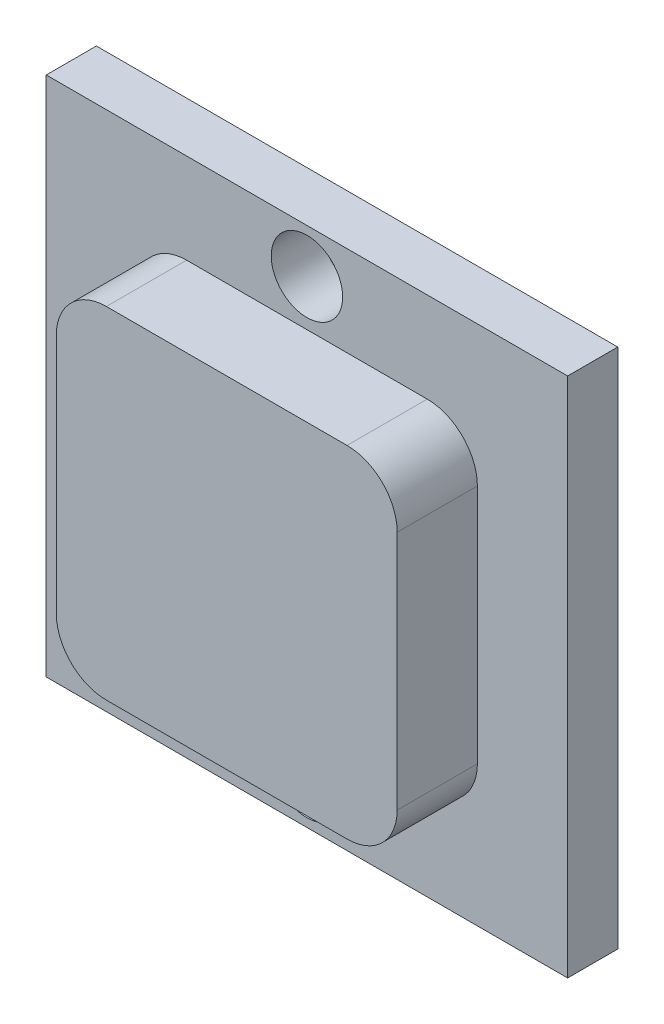
ISO-10303-21;
HEADER;
FILE_DESCRIPTION(('STEP AP214'),'2;1');
FILE_NAME('part.step','',(''),(''),'','','');
FILE_SCHEMA(('AUTOMOTIVE_DESIGN { 1 0 10303 214 1 1 1 1 }'));
ENDSEC;
DATA;
#1=APPLICATION_CONTEXT('core data for automotive mechanical design processes');
#2=APPLICATION_PROTOCOL_DEFINITION('international standard','automotive_design',2000,#1);
#3=PRODUCT_CONTEXT('',#1,'mechanical');
#4=PRODUCT('Part','Part','',(#3));
#5=PRODUCT_RELATED_PRODUCT_CATEGORY('part','',(#4));
#6=PRODUCT_DEFINITION_FORMATION('','',#4);
#7=PRODUCT_DEFINITION_CONTEXT('part definition',#1,'design');
#8=PRODUCT_DEFINITION('design','',#6,#7);
#9=PRODUCT_DEFINITION_SHAPE('','',#8);
#10=(LENGTH_UNIT() NAMED_UNIT(*) SI_UNIT(.MILLI.,.METRE.));
#11=(NAMED_UNIT(*) PLANE_ANGLE_UNIT() SI_UNIT($,.RADIAN.));
#12=(NAMED_UNIT(*) SI_UNIT($,.STERADIAN.) SOLID_ANGLE_UNIT());
#13=UNCERTAINTY_MEASURE_WITH_UNIT(LENGTH_MEASURE(1.E-05),#10,'distance_accuracy_value','');
#14=(GEOMETRIC_REPRESENTATION_CONTEXT(3) GLOBAL_UNCERTAINTY_ASSIGNED_CONTEXT((#13)) GLOBAL_UNIT_ASSIGNED_CONTEXT((#10,
#11,#12)) REPRESENTATION_CONTEXT('',''));
#15=CARTESIAN_POINT('',(0.,0.,0.));
#16=DIRECTION('',(0.,0.,1.));
#17=DIRECTION('',(1.,0.,0.));
#18=AXIS2_PLACEMENT_3D('',#15,#16,#17);
#19=CARTESIAN_POINT('',(0.,0.,4.1275));
#20=DIRECTION('',(0.,0.,1.));
#21=DIRECTION('',(1.,0.,0.));
#22=AXIS2_PLACEMENT_3D('',#19,#20,#21);
#23=PLANE('',#22);
#24=DIRECTION('',(1.,0.,0.));
#25=VECTOR('',#24,1.);
#26=CARTESIAN_POINT('',(2.8575,2.8575,4.1275));
#27=LINE('',#26,#25);
#28=CARTESIAN_POINT('',(4.445,2.8575,4.1275));
#29=VERTEX_POINT('',#28);
#30=CARTESIAN_POINT('',(12.065,2.8575,4.1275));
#31=VERTEX_POINT('',#30);
#32=EDGE_CURVE('E159',#29,#31,#27,.T.);
#33=ORIENTED_EDGE('',*,*,#32,.T.);
#34=CARTESIAN_POINT('',(12.065,4.445,4.1275));
#35=DIRECTION('',(0.,0.,-1.));
#36=DIRECTION('',(-1.,0.,0.));
#37=AXIS2_PLACEMENT_3D('',#34,#35,#36);
#38=CIRCLE('',#37,1.5875);
#39=CARTESIAN_POINT('',(13.6525,4.445,4.1275));
#40=VERTEX_POINT('',#39);
#41=EDGE_CURVE('E155',#40,#31,#38,.T.);
#42=ORIENTED_EDGE('',*,*,#41,.F.);
#43=DIRECTION('',(0.,1.,0.));
#44=VECTOR('',#43,1.);
#45=CARTESIAN_POINT('',(13.6525,13.6525,4.1275));
#46=LINE('',#45,#44);
#47=CARTESIAN_POINT('',(13.6525,12.065,4.1275));
#48=VERTEX_POINT('',#47);
#49=EDGE_CURVE('E108',#40,#48,#46,.T.);
#50=ORIENTED_EDGE('',*,*,#49,.T.);
#51=CARTESIAN_POINT('',(12.065,12.065,4.1275));
#52=DIRECTION('',(0.,0.,-1.));
#53=DIRECTION('',(-1.,0.,0.));
#54=AXIS2_PLACEMENT_3D('',#51,#52,#53);
#55=CIRCLE('',#54,1.5875);
#56=CARTESIAN_POINT('',(12.065,13.6525,4.1275));
#57=VERTEX_POINT('',#56);
#58=EDGE_CURVE('E19',#57,#48,#55,.T.);
#59=ORIENTED_EDGE('',*,*,#58,.F.);
#60=DIRECTION('',(1.,0.,0.));
#61=VECTOR('',#60,1.);
#62=CARTESIAN_POINT('',(2.8575,13.6525,4.1275));
#63=LINE('',#62,#61);
#64=CARTESIAN_POINT('',(4.445,13.6525,4.1275));
#65=VERTEX_POINT('',#64);
#66=EDGE_CURVE('E105',#57,#65,#63,.F.);
#67=ORIENTED_EDGE('',*,*,#66,.T.);
#68=CARTESIAN_POINT('',(4.445,12.065,4.1275));
#69=DIRECTION('',(0.,0.,-1.));
#70=DIRECTION('',(-1.,0.,0.));
#71=AXIS2_PLACEMENT_3D('',#68,#69,#70);
#72=CIRCLE('',#71,1.5875);
#73=CARTESIAN_POINT('',(2.8575,12.065,4.1275));
#74=VERTEX_POINT('',#73);
#75=EDGE_CURVE('E123',#74,#65,#72,.T.);
#76=ORIENTED_EDGE('',*,*,#75,.F.);
#77=DIRECTION('',(0.,1.,0.));
#78=VECTOR('',#77,1.);
#79=CARTESIAN_POINT('',(2.8575,13.6525,4.1275));
#80=LINE('',#79,#78);
#81=CARTESIAN_POINT('',(2.8575,4.445,4.1275));
#82=VERTEX_POINT('',#81);
#83=EDGE_CURVE('E127',#74,#82,#80,.F.);
#84=ORIENTED_EDGE('',*,*,#83,.T.);
#85=CARTESIAN_POINT('',(4.445,4.445,4.1275));
#86=DIRECTION('',(0.,0.,-1.));
#87=DIRECTION('',(-1.,0.,0.));
#88=AXIS2_PLACEMENT_3D('',#85,#86,#87);
#89=CIRCLE('',#88,1.5875);
#90=EDGE_CURVE('E160',#29,#82,#89,.T.);
#91=ORIENTED_EDGE('',*,*,#90,.F.);
#92=EDGE_LOOP('',(#33,#42,#50,#59,#67,#76,#84,#91));
#93=FACE_BOUND('',#92,.T.);
#94=ADVANCED_FACE('F16',(#93),#23,.T.);
#95=CARTESIAN_POINT('',(12.065,12.065,4.1275));
#96=DIRECTION('',(0.,0.,-1.));
#97=DIRECTION('',(-1.,0.,0.));
#98=AXIS2_PLACEMENT_3D('',#95,#96,#97);
#99=CYLINDRICAL_SURFACE('',#98,1.5875);
#100=CARTESIAN_POINT('',(12.065,12.065,1.5875));
#101=DIRECTION('',(0.,0.,-1.));
#102=DIRECTION('',(-1.,0.,0.));
#103=AXIS2_PLACEMENT_3D('',#100,#101,#102);
#104=CIRCLE('',#103,1.5875);
#105=CARTESIAN_POINT('',(13.6525,12.065,1.5875));
#106=VERTEX_POINT('',#105);
#107=CARTESIAN_POINT('',(12.065,13.6525,1.5875));
#108=VERTEX_POINT('',#107);
#109=EDGE_CURVE('E115',#106,#108,#104,.F.);
#110=ORIENTED_EDGE('',*,*,#109,.T.);
#111=DIRECTION('',(0.,0.,-1.));
#112=VECTOR('',#111,1.);
#113=CARTESIAN_POINT('',(12.065,13.6525,4.1275));
#114=LINE('',#113,#112);
#115=EDGE_CURVE('E111',#108,#57,#114,.F.);
#116=ORIENTED_EDGE('',*,*,#115,.T.);
#117=ORIENTED_EDGE('',*,*,#58,.T.);
#118=DIRECTION('',(0.,0.,1.));
#119=VECTOR('',#118,1.);
#120=CARTESIAN_POINT('',(13.6525,12.065,4.1275));
#121=LINE('',#120,#119);
#122=EDGE_CURVE('E154',#48,#106,#121,.F.);
#123=ORIENTED_EDGE('',*,*,#122,.T.);
#124=EDGE_LOOP('',(#110,#116,#117,#123));
#125=FACE_BOUND('',#124,.T.);
#126=ADVANCED_FACE('F113',(#125),#99,.T.);
#127=CARTESIAN_POINT('',(2.8575,13.6525,4.1275));
#128=DIRECTION('',(0.,-1.,0.));
#129=DIRECTION('',(0.,0.,-1.));
#130=AXIS2_PLACEMENT_3D('',#127,#128,#129);
#131=PLANE('',#130);
#132=ORIENTED_EDGE('',*,*,#115,.F.);
#133=DIRECTION('',(-1.,0.,0.));
#134=VECTOR('',#133,1.);
#135=CARTESIAN_POINT('',(0.,13.6525,1.5875));
#136=LINE('',#135,#134);
#137=CARTESIAN_POINT('',(4.445,13.6525,1.5875));
#138=VERTEX_POINT('',#137);
#139=EDGE_CURVE('E152',#108,#138,#136,.T.);
#140=ORIENTED_EDGE('',*,*,#139,.T.);
#141=DIRECTION('',(0.,0.,-1.));
#142=VECTOR('',#141,1.);
#143=CARTESIAN_POINT('',(4.445,13.6525,4.1275));
#144=LINE('',#143,#142);
#145=EDGE_CURVE('E121',#65,#138,#144,.T.);
#146=ORIENTED_EDGE('',*,*,#145,.F.);
#147=ORIENTED_EDGE('',*,*,#66,.F.);
#148=EDGE_LOOP('',(#132,#140,#146,#147));
#149=FACE_BOUND('',#148,.T.);
#150=ADVANCED_FACE('F119',(#149),#131,.F.);
#151=CARTESIAN_POINT('',(4.445,12.065,4.1275));
#152=DIRECTION('',(0.,0.,-1.));
#153=DIRECTION('',(-1.,0.,0.));
#154=AXIS2_PLACEMENT_3D('',#151,#152,#153);
#155=CYLINDRICAL_SURFACE('',#154,1.5875);
#156=CARTESIAN_POINT('',(4.445,12.065,1.5875));
#157=DIRECTION('',(0.,0.,-1.));
#158=DIRECTION('',(-1.,0.,0.));
#159=AXIS2_PLACEMENT_3D('',#156,#157,#158);
#160=CIRCLE('',#159,1.5875);
#161=CARTESIAN_POINT('',(2.8575,12.065,1.5875));
#162=VERTEX_POINT('',#161);
#163=EDGE_CURVE('E150',#138,#162,#160,.F.);
#164=ORIENTED_EDGE('',*,*,#163,.T.);
#165=DIRECTION('',(0.,0.,1.));
#166=VECTOR('',#165,1.);
#167=CARTESIAN_POINT('',(2.8575,12.065,4.1275));
#168=LINE('',#167,#166);
#169=EDGE_CURVE('E168',#162,#74,#168,.T.);
#170=ORIENTED_EDGE('',*,*,#169,.T.);
#171=ORIENTED_EDGE('',*,*,#75,.T.);
#172=ORIENTED_EDGE('',*,*,#145,.T.);
#173=EDGE_LOOP('',(#164,#170,#171,#172));
#174=FACE_BOUND('',#173,.T.);
#175=ADVANCED_FACE('F276',(#174),#155,.T.);
#176=CARTESIAN_POINT('',(2.8575,13.6525,4.1275));
#177=DIRECTION('',(1.,0.,0.));
#178=DIRECTION('',(0.,1.,0.));
#179=AXIS2_PLACEMENT_3D('',#176,#177,#178);
#180=PLANE('',#179);
#181=DIRECTION('',(0.,0.,-1.));
#182=VECTOR('',#181,1.);
#183=CARTESIAN_POINT('',(2.8575,4.445,4.1275));
#184=LINE('',#183,#182);
#185=CARTESIAN_POINT('',(2.8575,4.445,1.5875));
#186=VERTEX_POINT('',#185);
#187=EDGE_CURVE('E162',#82,#186,#184,.T.);
#188=ORIENTED_EDGE('',*,*,#187,.F.);
#189=ORIENTED_EDGE('',*,*,#83,.F.);
#190=ORIENTED_EDGE('',*,*,#169,.F.);
#191=DIRECTION('',(0.,1.,0.));
#192=VECTOR('',#191,1.);
#193=CARTESIAN_POINT('',(2.8575,0.,1.5875));
#194=LINE('',#193,#192);
#195=EDGE_CURVE('E149',#162,#186,#194,.F.);
#196=ORIENTED_EDGE('',*,*,#195,.T.);
#197=EDGE_LOOP('',(#188,#189,#190,#196));
#198=FACE_BOUND('',#197,.T.);
#199=ADVANCED_FACE('F273',(#198),#180,.F.);
#200=CARTESIAN_POINT('',(4.445,4.445,4.1275));
#201=DIRECTION('',(0.,0.,-1.));
#202=DIRECTION('',(-1.,0.,0.));
#203=AXIS2_PLACEMENT_3D('',#200,#201,#202);
#204=CYLINDRICAL_SURFACE('',#203,1.5875);
#205=CARTESIAN_POINT('',(4.445,4.445,1.5875));
#206=DIRECTION('',(0.,0.,-1.));
#207=DIRECTION('',(-1.,0.,0.));
#208=AXIS2_PLACEMENT_3D('',#205,#206,#207);
#209=CIRCLE('',#208,1.5875);
#210=CARTESIAN_POINT('',(4.445,2.8575,1.5875));
#211=VERTEX_POINT('',#210);
#212=EDGE_CURVE('E147',#186,#211,#209,.F.);
#213=ORIENTED_EDGE('',*,*,#212,.T.);
#214=DIRECTION('',(0.,0.,1.));
#215=VECTOR('',#214,1.);
#216=CARTESIAN_POINT('',(4.445,2.8575,4.1275));
#217=LINE('',#216,#215);
#218=EDGE_CURVE('E166',#211,#29,#217,.T.);
#219=ORIENTED_EDGE('',*,*,#218,.T.);
#220=ORIENTED_EDGE('',*,*,#90,.T.);
#221=ORIENTED_EDGE('',*,*,#187,.T.);
#222=EDGE_LOOP('',(#213,#219,#220,#221));
#223=FACE_BOUND('',#222,.T.);
#224=ADVANCED_FACE('F269',(#223),#204,.T.);
#225=CARTESIAN_POINT('',(2.8575,2.8575,4.1275));
#226=DIRECTION('',(0.,1.,0.));
#227=DIRECTION('',(0.,0.,1.));
#228=AXIS2_PLACEMENT_3D('',#225,#226,#227);
#229=PLANE('',#228);
#230=DIRECTION('',(0.,0.,-1.));
#231=VECTOR('',#230,1.);
#232=CARTESIAN_POINT('',(12.065,2.8575,4.1275));
#233=LINE('',#232,#231);
#234=CARTESIAN_POINT('',(12.065,2.8575,1.5875));
#235=VERTEX_POINT('',#234);
#236=EDGE_CURVE('E158',#31,#235,#233,.T.);
#237=ORIENTED_EDGE('',*,*,#236,.F.);
#238=ORIENTED_EDGE('',*,*,#32,.F.);
#239=ORIENTED_EDGE('',*,*,#218,.F.);
#240=DIRECTION('',(-1.,0.,0.));
#241=VECTOR('',#240,1.);
#242=CARTESIAN_POINT('',(0.,2.8575,1.5875));
#243=LINE('',#242,#241);
#244=EDGE_CURVE('E146',#211,#235,#243,.F.);
#245=ORIENTED_EDGE('',*,*,#244,.T.);
#246=EDGE_LOOP('',(#237,#238,#239,#245));
#247=FACE_BOUND('',#246,.T.);
#248=ADVANCED_FACE('F265',(#247),#229,.F.);
#249=CARTESIAN_POINT('',(12.065,4.445,4.1275));
#250=DIRECTION('',(0.,0.,-1.));
#251=DIRECTION('',(-1.,0.,0.));
#252=AXIS2_PLACEMENT_3D('',#249,#250,#251);
#253=CYLINDRICAL_SURFACE('',#252,1.5875);
#254=CARTESIAN_POINT('',(12.065,4.445,1.5875));
#255=DIRECTION('',(0.,0.,-1.));
#256=DIRECTION('',(-1.,0.,0.));
#257=AXIS2_PLACEMENT_3D('',#254,#255,#256);
#258=CIRCLE('',#257,1.5875);
#259=CARTESIAN_POINT('',(13.6525,4.445,1.5875));
#260=VERTEX_POINT('',#259);
#261=EDGE_CURVE('E144',#235,#260,#258,.F.);
#262=ORIENTED_EDGE('',*,*,#261,.T.);
#263=DIRECTION('',(0.,0.,1.));
#264=VECTOR('',#263,1.);
#265=CARTESIAN_POINT('',(13.6525,4.445,4.1275));
#266=LINE('',#265,#264);
#267=EDGE_CURVE('E178',#260,#40,#266,.T.);
#268=ORIENTED_EDGE('',*,*,#267,.T.);
#269=ORIENTED_EDGE('',*,*,#41,.T.);
#270=ORIENTED_EDGE('',*,*,#236,.T.);
#271=EDGE_LOOP('',(#262,#268,#269,#270));
#272=FACE_BOUND('',#271,.T.);
#273=ADVANCED_FACE('F261',(#272),#253,.T.);
#274=CARTESIAN_POINT('',(13.6525,13.6525,4.1275));
#275=DIRECTION('',(-1.,0.,0.));
#276=DIRECTION('',(0.,0.,1.));
#277=AXIS2_PLACEMENT_3D('',#274,#275,#276);
#278=PLANE('',#277);
#279=ORIENTED_EDGE('',*,*,#122,.F.);
#280=ORIENTED_EDGE('',*,*,#49,.F.);
#281=ORIENTED_EDGE('',*,*,#267,.F.);
#282=DIRECTION('',(0.,1.,0.));
#283=VECTOR('',#282,1.);
#284=CARTESIAN_POINT('',(13.6525,0.,1.5875));
#285=LINE('',#284,#283);
#286=EDGE_CURVE('E143',#260,#106,#285,.T.);
#287=ORIENTED_EDGE('',*,*,#286,.T.);
#288=EDGE_LOOP('',(#279,#280,#281,#287));
#289=FACE_BOUND('',#288,.T.);
#290=ADVANCED_FACE('F257',(#289),#278,.F.);
#291=CARTESIAN_POINT('',(0.,0.,1.5875));
#292=DIRECTION('',(0.,0.,-1.));
#293=DIRECTION('',(-1.,0.,0.));
#294=AXIS2_PLACEMENT_3D('',#291,#292,#293);
#295=PLANE('',#294);
#296=CARTESIAN_POINT('',(8.255,15.113,1.5875));
#297=DIRECTION('',(0.,0.,1.));
#298=DIRECTION('',(1.,0.,0.));
#299=AXIS2_PLACEMENT_3D('',#296,#297,#298);
#300=CIRCLE('',#299,1.1303);
#301=CARTESIAN_POINT('',(9.3853,15.113,1.5875));
#302=VERTEX_POINT('',#301);
#303=EDGE_CURVE('E140',#302,#302,#300,.F.);
#304=ORIENTED_EDGE('',*,*,#303,.T.);
#305=EDGE_LOOP('',(#304));
#306=FACE_BOUND('',#305,.T.);
#307=CARTESIAN_POINT('',(8.255,1.397,1.5875));
#308=DIRECTION('',(0.,0.,1.));
#309=DIRECTION('',(1.,0.,0.));
#310=AXIS2_PLACEMENT_3D('',#307,#308,#309);
#311=CIRCLE('',#310,1.1303);
#312=CARTESIAN_POINT('',(9.3853,1.397,1.5875));
#313=VERTEX_POINT('',#312);
#314=EDGE_CURVE('E136',#313,#313,#311,.F.);
#315=ORIENTED_EDGE('',*,*,#314,.T.);
#316=EDGE_LOOP('',(#315));
#317=FACE_BOUND('',#316,.T.);
#318=ORIENTED_EDGE('',*,*,#261,.F.);
#319=ORIENTED_EDGE('',*,*,#244,.F.);
#320=ORIENTED_EDGE('',*,*,#212,.F.);
#321=ORIENTED_EDGE('',*,*,#195,.F.);
#322=ORIENTED_EDGE('',*,*,#163,.F.);
#323=ORIENTED_EDGE('',*,*,#139,.F.);
#324=ORIENTED_EDGE('',*,*,#109,.F.);
#325=ORIENTED_EDGE('',*,*,#286,.F.);
#326=EDGE_LOOP('',(#318,#319,#320,#321,#322,#323,#324,#325));
#327=FACE_BOUND('',#326,.T.);
#328=DIRECTION('',(1.,0.,0.));
#329=VECTOR('',#328,1.);
#330=CARTESIAN_POINT('',(0.,0.,1.5875));
#331=LINE('',#330,#329);
#332=CARTESIAN_POINT('',(0.,0.,1.5875));
#333=VERTEX_POINT('',#332);
#334=CARTESIAN_POINT('',(16.51,0.,1.5875));
#335=VERTEX_POINT('',#334);
#336=EDGE_CURVE('E205',#333,#335,#331,.T.);
#337=ORIENTED_EDGE('',*,*,#336,.T.);
#338=DIRECTION('',(0.,1.,0.));
#339=VECTOR('',#338,1.);
#340=CARTESIAN_POINT('',(16.51,0.,1.5875));
#341=LINE('',#340,#339);
#342=CARTESIAN_POINT('',(16.51,16.51,1.5875));
#343=VERTEX_POINT('',#342);
#344=EDGE_CURVE('E198',#335,#343,#341,.T.);
#345=ORIENTED_EDGE('',*,*,#344,.T.);
#346=DIRECTION('',(1.,0.,0.));
#347=VECTOR('',#346,1.);
#348=CARTESIAN_POINT('',(0.,16.51,1.5875));
#349=LINE('',#348,#347);
#350=CARTESIAN_POINT('',(0.,16.51,1.5875));
#351=VERTEX_POINT('',#350);
#352=EDGE_CURVE('E194',#343,#351,#349,.F.);
#353=ORIENTED_EDGE('',*,*,#352,.T.);
#354=DIRECTION('',(0.,1.,0.));
#355=VECTOR('',#354,1.);
#356=CARTESIAN_POINT('',(0.,0.,1.5875));
#357=LINE('',#356,#355);
#358=EDGE_CURVE('E139',#351,#333,#357,.F.);
#359=ORIENTED_EDGE('',*,*,#358,.T.);
#360=EDGE_LOOP('',(#337,#345,#353,#359));
#361=FACE_BOUND('',#360,.T.);
#362=ADVANCED_FACE('F226',(#306,#317,#327,#361),#295,.F.);
#363=CARTESIAN_POINT('',(8.255,15.113,1.5875));
#364=DIRECTION('',(0.,0.,1.));
#365=DIRECTION('',(1.,0.,0.));
#366=AXIS2_PLACEMENT_3D('',#363,#364,#365);
#367=CYLINDRICAL_SURFACE('',#366,1.1303);
#368=CARTESIAN_POINT('',(8.255,15.113,0.));
#369=DIRECTION('',(0.,0.,1.));
#370=DIRECTION('',(1.,0.,0.));
#371=AXIS2_PLACEMENT_3D('',#368,#369,#370);
#372=CIRCLE('',#371,1.1303);
#373=CARTESIAN_POINT('',(9.3853,15.113,0.));
#374=VERTEX_POINT('',#373);
#375=EDGE_CURVE('E133',#374,#374,#372,.T.);
#376=ORIENTED_EDGE('',*,*,#375,.F.);
#377=EDGE_LOOP('',(#376));
#378=FACE_BOUND('',#377,.T.);
#379=ORIENTED_EDGE('',*,*,#303,.F.);
#380=EDGE_LOOP('',(#379));
#381=FACE_BOUND('',#380,.T.);
#382=ADVANCED_FACE('F250',(#378,#381),#367,.F.);
#383=CARTESIAN_POINT('',(8.255,1.397,1.5875));
#384=DIRECTION('',(0.,0.,1.));
#385=DIRECTION('',(1.,0.,0.));
#386=AXIS2_PLACEMENT_3D('',#383,#384,#385);
#387=CYLINDRICAL_SURFACE('',#386,1.1303);
#388=CARTESIAN_POINT('',(8.255,1.397,0.));
#389=DIRECTION('',(0.,0.,1.));
#390=DIRECTION('',(1.,0.,0.));
#391=AXIS2_PLACEMENT_3D('',#388,#389,#390);
#392=CIRCLE('',#391,1.1303);
#393=CARTESIAN_POINT('',(9.3853,1.397,0.));
#394=VERTEX_POINT('',#393);
#395=EDGE_CURVE('E129',#394,#394,#392,.T.);
#396=ORIENTED_EDGE('',*,*,#395,.F.);
#397=EDGE_LOOP('',(#396));
#398=FACE_BOUND('',#397,.T.);
#399=ORIENTED_EDGE('',*,*,#314,.F.);
#400=EDGE_LOOP('',(#399));
#401=FACE_BOUND('',#400,.T.);
#402=ADVANCED_FACE('F247',(#398,#401),#387,.F.);
#403=CARTESIAN_POINT('',(0.,0.,1.5875));
#404=DIRECTION('',(1.,0.,0.));
#405=DIRECTION('',(0.,0.,-1.));
#406=AXIS2_PLACEMENT_3D('',#403,#404,#405);
#407=PLANE('',#406);
#408=DIRECTION('',(0.,0.,1.));
#409=VECTOR('',#408,1.);
#410=CARTESIAN_POINT('',(0.,0.,1.5875));
#411=LINE('',#410,#409);
#412=CARTESIAN_POINT('',(0.,0.,0.));
#413=VERTEX_POINT('',#412);
#414=EDGE_CURVE('E202',#413,#333,#411,.T.);
#415=ORIENTED_EDGE('',*,*,#414,.T.);
#416=ORIENTED_EDGE('',*,*,#358,.F.);
#417=DIRECTION('',(0.,0.,-1.));
#418=VECTOR('',#417,1.);
#419=CARTESIAN_POINT('',(0.,16.51,1.5875));
#420=LINE('',#419,#418);
#421=CARTESIAN_POINT('',(0.,16.51,0.));
#422=VERTEX_POINT('',#421);
#423=EDGE_CURVE('E196',#351,#422,#420,.T.);
#424=ORIENTED_EDGE('',*,*,#423,.T.);
#425=DIRECTION('',(0.,1.,0.));
#426=VECTOR('',#425,1.);
#427=CARTESIAN_POINT('',(0.,0.,0.));
#428=LINE('',#427,#426);
#429=EDGE_CURVE('E132',#413,#422,#428,.T.);
#430=ORIENTED_EDGE('',*,*,#429,.F.);
#431=EDGE_LOOP('',(#415,#416,#424,#430));
#432=FACE_BOUND('',#431,.T.);
#433=ADVANCED_FACE('F228',(#432),#407,.F.);
#434=CARTESIAN_POINT('',(0.,16.51,1.5875));
#435=DIRECTION('',(0.,-1.,0.));
#436=DIRECTION('',(0.,0.,-1.));
#437=AXIS2_PLACEMENT_3D('',#434,#435,#436);
#438=PLANE('',#437);
#439=ORIENTED_EDGE('',*,*,#423,.F.);
#440=ORIENTED_EDGE('',*,*,#352,.F.);
#441=DIRECTION('',(0.,0.,1.));
#442=VECTOR('',#441,1.);
#443=CARTESIAN_POINT('',(16.51,16.51,1.5875));
#444=LINE('',#443,#442);
#445=CARTESIAN_POINT('',(16.51,16.51,0.));
#446=VERTEX_POINT('',#445);
#447=EDGE_CURVE('E200',#343,#446,#444,.F.);
#448=ORIENTED_EDGE('',*,*,#447,.T.);
#449=DIRECTION('',(-1.,0.,0.));
#450=VECTOR('',#449,1.);
#451=CARTESIAN_POINT('',(0.,16.51,0.));
#452=LINE('',#451,#450);
#453=EDGE_CURVE('E210',#422,#446,#452,.F.);
#454=ORIENTED_EDGE('',*,*,#453,.F.);
#455=EDGE_LOOP('',(#439,#440,#448,#454));
#456=FACE_BOUND('',#455,.T.);
#457=ADVANCED_FACE('F223',(#456),#438,.F.);
#458=CARTESIAN_POINT('',(16.51,0.,1.5875));
#459=DIRECTION('',(-1.,0.,0.));
#460=DIRECTION('',(0.,0.,1.));
#461=AXIS2_PLACEMENT_3D('',#458,#459,#460);
#462=PLANE('',#461);
#463=ORIENTED_EDGE('',*,*,#447,.F.);
#464=ORIENTED_EDGE('',*,*,#344,.F.);
#465=DIRECTION('',(0.,0.,1.));
#466=VECTOR('',#465,1.);
#467=CARTESIAN_POINT('',(16.51,0.,1.5875));
#468=LINE('',#467,#466);
#469=CARTESIAN_POINT('',(16.51,0.,0.));
#470=VERTEX_POINT('',#469);
#471=EDGE_CURVE('E34',#335,#470,#468,.F.);
#472=ORIENTED_EDGE('',*,*,#471,.T.);
#473=DIRECTION('',(0.,1.,0.));
#474=VECTOR('',#473,1.);
#475=CARTESIAN_POINT('',(16.51,0.,0.));
#476=LINE('',#475,#474);
#477=EDGE_CURVE('E25',#446,#470,#476,.F.);
#478=ORIENTED_EDGE('',*,*,#477,.F.);
#479=EDGE_LOOP('',(#463,#464,#472,#478));
#480=FACE_BOUND('',#479,.T.);
#481=ADVANCED_FACE('F219',(#480),#462,.F.);
#482=CARTESIAN_POINT('',(0.,0.,1.5875));
#483=DIRECTION('',(0.,1.,0.));
#484=DIRECTION('',(0.,0.,1.));
#485=AXIS2_PLACEMENT_3D('',#482,#483,#484);
#486=PLANE('',#485);
#487=ORIENTED_EDGE('',*,*,#471,.F.);
#488=ORIENTED_EDGE('',*,*,#336,.F.);
#489=ORIENTED_EDGE('',*,*,#414,.F.);
#490=DIRECTION('',(-1.,0.,0.));
#491=VECTOR('',#490,1.);
#492=CARTESIAN_POINT('',(0.,0.,0.));
#493=LINE('',#492,#491);
#494=EDGE_CURVE('E11',#470,#413,#493,.T.);
#495=ORIENTED_EDGE('',*,*,#494,.F.);
#496=EDGE_LOOP('',(#487,#488,#489,#495));
#497=FACE_BOUND('',#496,.T.);
#498=ADVANCED_FACE('F232',(#497),#486,.F.);
#499=CARTESIAN_POINT('',(0.,0.,0.));
#500=DIRECTION('',(0.,0.,-1.));
#501=DIRECTION('',(-1.,0.,0.));
#502=AXIS2_PLACEMENT_3D('',#499,#500,#501);
#503=PLANE('',#502);
#504=ORIENTED_EDGE('',*,*,#477,.T.);
#505=ORIENTED_EDGE('',*,*,#494,.T.);
#506=ORIENTED_EDGE('',*,*,#429,.T.);
#507=ORIENTED_EDGE('',*,*,#453,.T.);
#508=EDGE_LOOP('',(#504,#505,#506,#507));
#509=FACE_BOUND('',#508,.T.);
#510=ORIENTED_EDGE('',*,*,#395,.T.);
#511=EDGE_LOOP('',(#510));
#512=FACE_BOUND('',#511,.T.);
#513=ORIENTED_EDGE('',*,*,#375,.T.);
#514=EDGE_LOOP('',(#513));
#515=FACE_BOUND('',#514,.T.);
#516=ADVANCED_FACE('F215',(#509,#512,#515),#503,.T.);
#517=CLOSED_SHELL('',(#94,#126,#150,#175,#199,#224,#248,#273,#290,#362,#382,#402,#433,#457,#481,
#498,#516));
#518=MANIFOLD_SOLID_BREP('B1',#517);
#519=ADVANCED_BREP_SHAPE_REPRESENTATION('',(#18,#518),#14);
#520=SHAPE_DEFINITION_REPRESENTATION(#9,#519);
ENDSEC;
END-ISO-10303-21;
